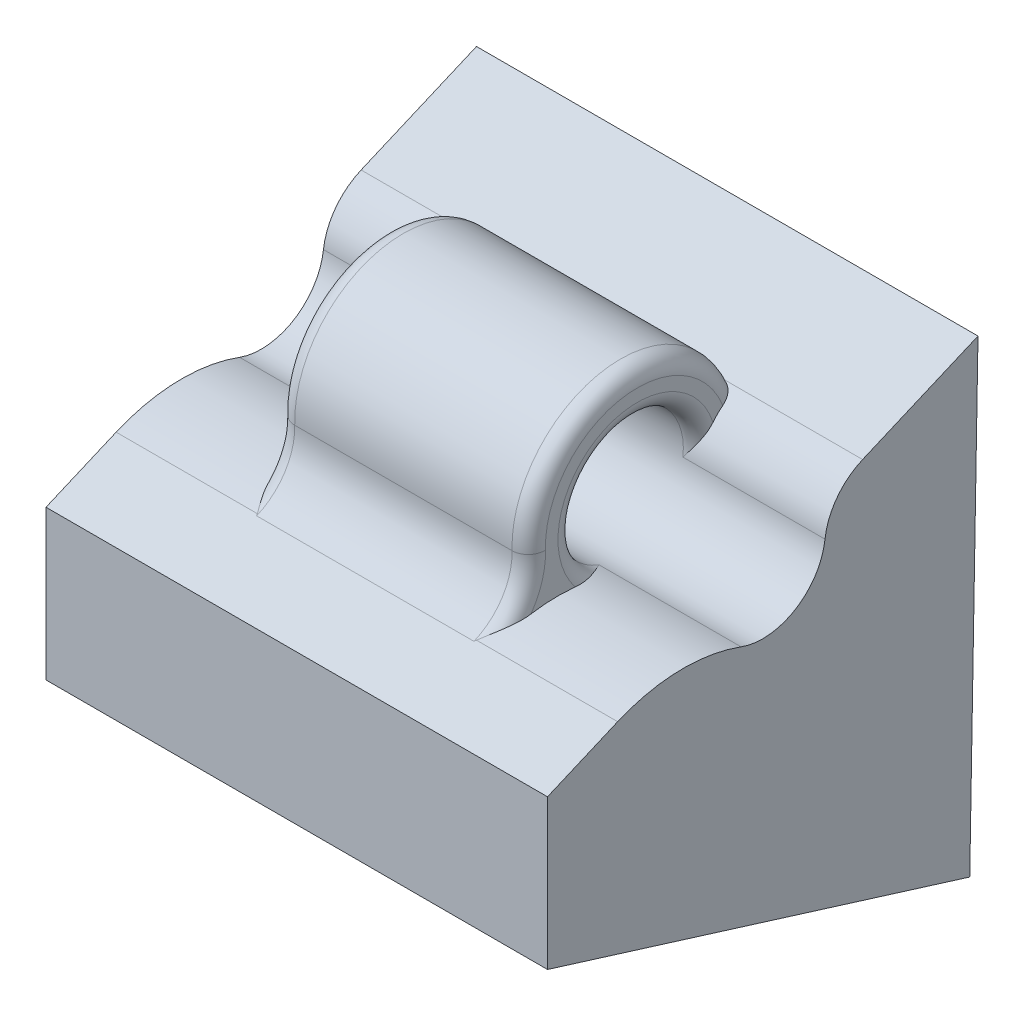
ISO-10303-21;
HEADER;
FILE_DESCRIPTION(('STEP AP214'),'2;1');
FILE_NAME('part.step','',(''),(''),'','','');
FILE_SCHEMA(('AUTOMOTIVE_DESIGN { 1 0 10303 214 1 1 1 1 }'));
ENDSEC;
DATA;
#1=APPLICATION_CONTEXT('core data for automotive mechanical design processes');
#2=APPLICATION_PROTOCOL_DEFINITION('international standard','automotive_design',2000,#1);
#3=PRODUCT_CONTEXT('',#1,'mechanical');
#4=PRODUCT('Part','Part','',(#3));
#5=PRODUCT_RELATED_PRODUCT_CATEGORY('part','',(#4));
#6=PRODUCT_DEFINITION_FORMATION('','',#4);
#7=PRODUCT_DEFINITION_CONTEXT('part definition',#1,'design');
#8=PRODUCT_DEFINITION('design','',#6,#7);
#9=PRODUCT_DEFINITION_SHAPE('','',#8);
#10=(LENGTH_UNIT() NAMED_UNIT(*) SI_UNIT(.MILLI.,.METRE.));
#11=(NAMED_UNIT(*) PLANE_ANGLE_UNIT() SI_UNIT($,.RADIAN.));
#12=(NAMED_UNIT(*) SI_UNIT($,.STERADIAN.) SOLID_ANGLE_UNIT());
#13=UNCERTAINTY_MEASURE_WITH_UNIT(LENGTH_MEASURE(1.E-05),#10,'distance_accuracy_value','');
#14=(GEOMETRIC_REPRESENTATION_CONTEXT(3) GLOBAL_UNCERTAINTY_ASSIGNED_CONTEXT((#13)) GLOBAL_UNIT_ASSIGNED_CONTEXT((#10,
#11,#12)) REPRESENTATION_CONTEXT('',''));
#15=CARTESIAN_POINT('',(0.,0.,0.));
#16=DIRECTION('',(0.,0.,1.));
#17=DIRECTION('',(1.,0.,0.));
#18=AXIS2_PLACEMENT_3D('',#15,#16,#17);
#19=CARTESIAN_POINT('',(-15.,-19.3262857115008,-5.66862767233871));
#20=DIRECTION('',(1.,0.,0.));
#21=DIRECTION('',(0.,0.,-1.));
#22=AXIS2_PLACEMENT_3D('',#19,#20,#21);
#23=CYLINDRICAL_SURFACE('',#22,20.);
#24=CARTESIAN_POINT('',(15.,-19.3262857115008,-5.66862767233871));
#25=DIRECTION('',(1.,0.,0.));
#26=DIRECTION('',(0.,0.,-1.));
#27=AXIS2_PLACEMENT_3D('',#24,#25,#26);
#28=CIRCLE('',#27,20.);
#29=CARTESIAN_POINT('',(15.,0.412883046353719,-2.44912200392603));
#30=VERTEX_POINT('',#29);
#31=CARTESIAN_POINT('',(15.,0.566287855537386,-7.73877667180103));
#32=VERTEX_POINT('',#31);
#33=EDGE_CURVE('E278',#30,#32,#28,.F.);
#34=ORIENTED_EDGE('',*,*,#33,.F.);
#35=CARTESIAN_POINT('',(15.,0.412883046353719,-2.44912200392603));
#36=CARTESIAN_POINT('',(14.9999712425001,0.392012198522315,-2.32109758519576));
#37=CARTESIAN_POINT('',(14.9935706108891,0.369901398564982,-2.19343269968543));
#38=CARTESIAN_POINT('',(14.9696875011824,0.323452890386708,-1.93978694534235));
#39=CARTESIAN_POINT('',(14.9522264673852,0.299119569224137,-1.8138032984124));
#40=CARTESIAN_POINT('',(14.9081962437952,0.248767911984274,-1.56581270127505));
#41=CARTESIAN_POINT('',(14.8817641035994,0.222779450848537,-1.44377453533818));
#42=CARTESIAN_POINT('',(14.8210753723815,0.16897148383558,-1.20205448064926));
#43=CARTESIAN_POINT('',(14.7868165265419,0.141151451943277,-1.08237328173612));
#44=CARTESIAN_POINT('',(14.7044614832426,0.0783359396207669,-0.822830786295997));
#45=CARTESIAN_POINT('',(14.6549716125155,0.0429874180444211,-0.683500125342862));
#46=CARTESIAN_POINT('',(14.5482955722852,-0.0299068648678995,-0.408397379718972));
#47=CARTESIAN_POINT('',(14.491107319599,-0.0674532193780413,-0.272626270185926));
#48=CARTESIAN_POINT('',(14.3703375113502,-0.14471500201004,-0.00409554854887269));
#49=CARTESIAN_POINT('',(14.3067375453569,-0.184436517544798,0.128653967943245));
#50=CARTESIAN_POINT('',(14.1745777181307,-0.265858639660227,0.390991130587072));
#51=CARTESIAN_POINT('',(14.1060186915753,-0.307558912784427,0.520579303948582));
#52=CARTESIAN_POINT('',(13.96251036623,-0.394454457632333,0.781594432597753));
#53=CARTESIAN_POINT('',(13.887419835391,-0.439721517512311,0.912919458458649));
#54=CARTESIAN_POINT('',(13.7725265920543,-0.5092204144354,1.10800980810453));
#55=CARTESIAN_POINT('',(13.7338490574858,-0.532655256492938,1.17272940656447));
#56=CARTESIAN_POINT('',(13.6558782579908,-0.580067740311381,1.30159662606592));
#57=CARTESIAN_POINT('',(13.6165849953779,-0.604045380032892,1.36574424925519));
#58=CARTESIAN_POINT('',(13.5378240354276,-0.652376630093399,1.49305652589641));
#59=CARTESIAN_POINT('',(13.498359853992,-0.676726074419333,1.55622494324603));
#60=CARTESIAN_POINT('',(13.419129283196,-0.725998525516448,1.68214702818652));
#61=CARTESIAN_POINT('',(13.3793628948121,-0.750921530434878,1.74490069711629));
#62=CARTESIAN_POINT('',(13.299809595018,-0.801384193369101,1.87011084484688));
#63=CARTESIAN_POINT('',(13.2600226952933,-0.826923637369684,1.93256741802897));
#64=CARTESIAN_POINT('',(13.2007903023415,-0.865810726555095,2.02630666388542));
#65=CARTESIAN_POINT('',(13.181120181929,-0.878869855541046,2.05756318737693));
#66=CARTESIAN_POINT('',(13.1425380556263,-0.905317411519973,2.12040785124825));
#67=CARTESIAN_POINT('',(13.1236261746364,-0.91870589218375,2.15199604518952));
#68=CARTESIAN_POINT('',(13.1054009590093,-0.932325399285941,2.1839021131932));
#69=B_SPLINE_CURVE_WITH_KNOTS('',3,(#35,#36,#37,#38,#39,#40,#41,#42,#43,#44,#45,#46,#47,#48,#49,
#50,#51,#52,#53,#54,#55,#56,#57,#58,#59,#60,#61,#62,#63,#64,#65,#66,#67,#68),.UNSPECIFIED.,.F.,
.F.,(4,2,2,2,2,2,2,2,2,2,2,2,2,2,2,2,4),(0.,0.388758995316807,0.776766548423315,
1.15909513205429,1.54153400100867,1.99730141098121,2.45319240051073,2.91043187224491,
3.36759456261266,3.84122604705611,4.07808398727538,4.31494103772192,4.55002246815443,
4.78510313931934,5.02010333693873,5.13761127789712,5.25513849636359),.UNSPECIFIED.);
#70=CARTESIAN_POINT('',(13.1054009590091,-0.932325399285929,2.18390211319316));
#71=VERTEX_POINT('',#70);
#72=EDGE_CURVE('E355',#30,#71,#69,.T.);
#73=ORIENTED_EDGE('',*,*,#72,.T.);
#74=DIRECTION('',(1.,0.,0.));
#75=VECTOR('',#74,1.);
#76=CARTESIAN_POINT('',(-30.,-0.932325399285929,2.18390211319316));
#77=LINE('',#76,#75);
#78=CARTESIAN_POINT('',(30.,-0.932325399285929,2.18390211319316));
#79=VERTEX_POINT('',#78);
#80=EDGE_CURVE('E259',#79,#71,#77,.F.);
#81=ORIENTED_EDGE('',*,*,#80,.F.);
#82=CARTESIAN_POINT('',(30.,-19.3262857115008,-5.66862767233871));
#83=DIRECTION('',(1.,0.,0.));
#84=DIRECTION('',(0.,0.,-1.));
#85=AXIS2_PLACEMENT_3D('',#82,#83,#84);
#86=CIRCLE('',#85,20.);
#87=CARTESIAN_POINT('',(30.,-0.559287322726545,-12.5823655525122));
#88=VERTEX_POINT('',#87);
#89=EDGE_CURVE('E271',#88,#79,#86,.T.);
#90=ORIENTED_EDGE('',*,*,#89,.F.);
#91=DIRECTION('',(1.,0.,0.));
#92=VECTOR('',#91,1.);
#93=CARTESIAN_POINT('',(-15.,-0.559287322726545,-12.5823655525122));
#94=LINE('',#93,#92);
#95=CARTESIAN_POINT('',(13.,-0.559287322726544,-12.5823655525122));
#96=VERTEX_POINT('',#95);
#97=EDGE_CURVE('E262',#96,#88,#94,.T.);
#98=ORIENTED_EDGE('',*,*,#97,.F.);
#99=CARTESIAN_POINT('',(15.,0.566287855537388,-7.73877667180103));
#100=CARTESIAN_POINT('',(14.9999712824843,0.552876355309134,-7.86774863849179));
#101=CARTESIAN_POINT('',(14.9935733410965,0.538207071912411,-7.9964337137294));
#102=CARTESIAN_POINT('',(14.9697025239842,0.506554132193944,-8.25221480091346));
#103=CARTESIAN_POINT('',(14.9522543338735,0.489575700591173,-8.37931371257186));
#104=CARTESIAN_POINT('',(14.9082501475066,0.453703975215936,-8.62967663138598));
#105=CARTESIAN_POINT('',(14.8818285864447,0.434841692259891,-8.75296949969496));
#106=CARTESIAN_POINT('',(14.8211511884142,0.395148190183763,-8.99734695182514));
#107=CARTESIAN_POINT('',(14.7868906373842,0.374315790753399,-9.11843015934116));
#108=CARTESIAN_POINT('',(14.7018857686527,0.325130966729402,-9.38957734524561));
#109=CARTESIAN_POINT('',(14.6491744564062,0.296238247825559,-9.53892332934081));
#110=CARTESIAN_POINT('',(14.5352090099173,0.23577069497492,-9.83379476285277));
#111=CARTESIAN_POINT('',(14.4739510431471,0.204194660261093,-9.97931846328363));
#112=CARTESIAN_POINT('',(14.3445419157242,0.13849458823674,-10.2669011994642));
#113=CARTESIAN_POINT('',(14.2763815210566,0.104367154084579,-10.4089552698466));
#114=CARTESIAN_POINT('',(14.1346928084361,0.0337027584337625,-10.6897622999649));
#115=CARTESIAN_POINT('',(14.0611634240563,-0.00283468161728427,-10.8285145965827));
#116=CARTESIAN_POINT('',(13.8332777576799,-0.116566381528935,-11.2426063812963));
#117=CARTESIAN_POINT('',(13.6726912463684,-0.197357487692704,-11.5135144077749));
#118=CARTESIAN_POINT('',(13.3439632401528,-0.36861681530225,-12.0471250792966));
#119=CARTESIAN_POINT('',(13.1758275200498,-0.459077710550422,-12.3098337442285));
#120=CARTESIAN_POINT('',(13.0051006104007,-0.556376724584916,-12.5744610096459));
#121=CARTESIAN_POINT('',(13.0025503032892,-0.557831403619126,-12.5784135115691));
#122=CARTESIAN_POINT('',(13.,-0.559287322726544,-12.5823655525122));
#123=B_SPLINE_CURVE_WITH_KNOTS('',3,(#99,#100,#101,#102,#103,#104,#105,#106,#107,#108,#109,#110,
#111,#112,#113,#114,#115,#116,#117,#118,#119,#120,#121,#122),.UNSPECIFIED.,.F.,.F.,(4,2,2,2,2,2,
2,2,2,2,2,4),(0.,0.388617932635206,0.776370762978743,1.15855348078632,1.54096663518821,
2.02356449711834,2.50637946740758,2.9898490975625,3.47341502048871,4.44820459085722,
5.42226078926612,5.43703176878379),.UNSPECIFIED.);
#124=EDGE_CURVE('E58',#96,#32,#123,.F.);
#125=ORIENTED_EDGE('',*,*,#124,.T.);
#126=EDGE_LOOP('',(#34,#73,#81,#90,#98,#125));
#127=FACE_BOUND('',#126,.T.);
#128=ADVANCED_FACE('F47',(#127),#23,.T.);
#129=CARTESIAN_POINT('',(-30.,0.,0.));
#130=DIRECTION('',(0.,-0.919698015610742,-0.392626489276593));
#131=DIRECTION('',(0.,0.392626489276593,-0.919698015610742));
#132=AXIS2_PLACEMENT_3D('',#129,#130,#131);
#133=PLANE('',#132);
#134=DIRECTION('',(1.,0.,0.));
#135=VECTOR('',#134,1.);
#136=CARTESIAN_POINT('',(-15.,11.5824814336595,-27.1310914605169));
#137=LINE('',#136,#135);
#138=CARTESIAN_POINT('',(-13.,11.5824814336595,-27.1310914605169));
#139=VERTEX_POINT('',#138);
#140=CARTESIAN_POINT('',(13.,11.5824814336595,-27.1310914605169));
#141=VERTEX_POINT('',#140);
#142=EDGE_CURVE('E238',#139,#141,#137,.T.);
#143=ORIENTED_EDGE('',*,*,#142,.T.);
#144=CARTESIAN_POINT('',(13.,10.7972284551063,-25.2916954292954));
#145=DIRECTION('',(0.,-0.919698015610742,-0.392626489276593));
#146=DIRECTION('',(0.,0.392626489276593,-0.919698015610742));
#147=AXIS2_PLACEMENT_3D('',#144,#145,#146);
#148=CIRCLE('',#147,2.);
#149=CARTESIAN_POINT('',(13.1959164333708,11.5787047817472,-27.1222449375128));
#150=VERTEX_POINT('',#149);
#151=EDGE_CURVE('E492',#141,#150,#148,.T.);
#152=ORIENTED_EDGE('',*,*,#151,.T.);
#153=DIRECTION('',(1.,0.,0.));
#154=VECTOR('',#153,1.);
#155=CARTESIAN_POINT('',(-30.,11.5787047817472,-27.1222449375128));
#156=LINE('',#155,#154);
#157=CARTESIAN_POINT('',(30.,11.5787047817472,-27.1222449375128));
#158=VERTEX_POINT('',#157);
#159=EDGE_CURVE('E74',#150,#158,#156,.T.);
#160=ORIENTED_EDGE('',*,*,#159,.T.);
#161=DIRECTION('',(0.,0.392626489276593,-0.919698015610742));
#162=VECTOR('',#161,1.);
#163=CARTESIAN_POINT('',(30.,0.,0.));
#164=LINE('',#163,#162);
#165=CARTESIAN_POINT('',(30.,17.4718787728084,-40.926561694678));
#166=VERTEX_POINT('',#165);
#167=EDGE_CURVE('E248',#158,#166,#164,.T.);
#168=ORIENTED_EDGE('',*,*,#167,.T.);
#169=DIRECTION('',(1.,0.,0.));
#170=VECTOR('',#169,1.);
#171=CARTESIAN_POINT('',(-30.,17.4718787728084,-40.926561694678));
#172=LINE('',#171,#170);
#173=CARTESIAN_POINT('',(-30.,17.4718787728084,-40.926561694678));
#174=VERTEX_POINT('',#173);
#175=EDGE_CURVE('E200',#174,#166,#172,.T.);
#176=ORIENTED_EDGE('',*,*,#175,.F.);
#177=DIRECTION('',(0.,0.392626489276593,-0.919698015610742));
#178=VECTOR('',#177,1.);
#179=CARTESIAN_POINT('',(-30.,0.,0.));
#180=LINE('',#179,#178);
#181=CARTESIAN_POINT('',(-30.,11.5787047817472,-27.1222449375128));
#182=VERTEX_POINT('',#181);
#183=EDGE_CURVE('E253',#182,#174,#180,.T.);
#184=ORIENTED_EDGE('',*,*,#183,.F.);
#185=DIRECTION('',(1.,0.,0.));
#186=VECTOR('',#185,1.);
#187=CARTESIAN_POINT('',(-30.,11.5787047817472,-27.1222449375128));
#188=LINE('',#187,#186);
#189=CARTESIAN_POINT('',(-13.1959164333708,11.5787047817472,-27.1222449375128));
#190=VERTEX_POINT('',#189);
#191=EDGE_CURVE('E66',#182,#190,#188,.T.);
#192=ORIENTED_EDGE('',*,*,#191,.T.);
#193=CARTESIAN_POINT('',(-13.,10.7972284551063,-25.2916954292954));
#194=DIRECTION('',(0.,-0.919698015610742,-0.392626489276593));
#195=DIRECTION('',(0.,0.392626489276593,-0.919698015610742));
#196=AXIS2_PLACEMENT_3D('',#193,#194,#195);
#197=CIRCLE('',#196,2.);
#198=EDGE_CURVE('E410',#190,#139,#197,.T.);
#199=ORIENTED_EDGE('',*,*,#198,.T.);
#200=EDGE_LOOP('',(#143,#152,#160,#168,#176,#184,#192,#199));
#201=FACE_BOUND('',#200,.T.);
#202=ADVANCED_FACE('F455',(#201),#133,.F.);
#203=ORIENTED_EDGE('',*,*,#80,.T.);
#204=CARTESIAN_POINT('',(13.1054009590091,-0.932325399285926,2.18390211319316));
#205=CARTESIAN_POINT('',(13.0729275930426,-0.9570380494792,2.24178963724971));
#206=CARTESIAN_POINT('',(13.0404429995258,-0.981748423814734,2.2996718302807));
#207=CARTESIAN_POINT('',(13.0052981935809,-1.00847066986816,2.3622666814668));
#208=CARTESIAN_POINT('',(13.0026491340948,-1.0104848023204,2.36698463522209));
#209=CARTESIAN_POINT('',(13.,-1.01249891964926,2.37170255355197));
#210=B_SPLINE_CURVE_WITH_KNOTS('',3,(#204,#205,#206,#207,#208,#209),.UNSPECIFIED.,.F.,.F.,(4,2,
4),(0.,0.212475403688337,0.229795911764035),.UNSPECIFIED.);
#211=CARTESIAN_POINT('',(13.,-1.01249891964926,2.37170255355197));
#212=VERTEX_POINT('',#211);
#213=EDGE_CURVE('E365',#71,#212,#210,.T.);
#214=ORIENTED_EDGE('',*,*,#213,.T.);
#215=DIRECTION('',(1.,0.,0.));
#216=VECTOR('',#215,1.);
#217=CARTESIAN_POINT('',(-30.,-1.01249891964926,2.37170255355197));
#218=LINE('',#217,#216);
#219=CARTESIAN_POINT('',(-13.,-1.01249891964926,2.37170255355197));
#220=VERTEX_POINT('',#219);
#221=EDGE_CURVE('E310',#212,#220,#218,.F.);
#222=ORIENTED_EDGE('',*,*,#221,.T.);
#223=CARTESIAN_POINT('',(-13.1054009590092,-0.932325399285929,2.18390211319316));
#224=CARTESIAN_POINT('',(-13.0729275930435,-0.957038049479378,2.24178963725011));
#225=CARTESIAN_POINT('',(-13.0404429995267,-0.981748423814924,2.29967183028114));
#226=CARTESIAN_POINT('',(-13.0052981935811,-1.00847066986818,2.36226668146687));
#227=CARTESIAN_POINT('',(-13.0026491340948,-1.01048480232041,2.36698463522212));
#228=CARTESIAN_POINT('',(-13.,-1.01249891964926,2.37170255355197));
#229=B_SPLINE_CURVE_WITH_KNOTS('',3,(#223,#224,#225,#226,#227,#228),.UNSPECIFIED.,.F.,.F.,(4,2,
4),(0.,0.212475403688361,0.229795911764061),.UNSPECIFIED.);
#230=CARTESIAN_POINT('',(-13.1054009590092,-0.932325399285929,2.18390211319316));
#231=VERTEX_POINT('',#230);
#232=EDGE_CURVE('E486',#220,#231,#229,.F.);
#233=ORIENTED_EDGE('',*,*,#232,.T.);
#234=CARTESIAN_POINT('',(-30.,-0.932325399285929,2.18390211319316));
#235=VERTEX_POINT('',#234);
#236=EDGE_CURVE('E258',#231,#235,#77,.F.);
#237=ORIENTED_EDGE('',*,*,#236,.T.);
#238=CARTESIAN_POINT('',(-30.,-4.51520462668082,10.5765271795235));
#239=VERTEX_POINT('',#238);
#240=EDGE_CURVE('E254',#239,#235,#180,.T.);
#241=ORIENTED_EDGE('',*,*,#240,.F.);
#242=DIRECTION('',(1.,0.,0.));
#243=VECTOR('',#242,1.);
#244=CARTESIAN_POINT('',(-30.,-4.51520462668082,10.5765271795235));
#245=LINE('',#244,#243);
#246=CARTESIAN_POINT('',(30.,-4.51520462668082,10.5765271795235));
#247=VERTEX_POINT('',#246);
#248=EDGE_CURVE('E239',#239,#247,#245,.T.);
#249=ORIENTED_EDGE('',*,*,#248,.T.);
#250=EDGE_CURVE('E249',#247,#79,#164,.T.);
#251=ORIENTED_EDGE('',*,*,#250,.T.);
#252=EDGE_LOOP('',(#203,#214,#222,#233,#237,#241,#249,#251));
#253=FACE_BOUND('',#252,.T.);
#254=ADVANCED_FACE('F382',(#253),#133,.F.);
#255=CARTESIAN_POINT('',(-30.,0.,0.));
#256=DIRECTION('',(1.,0.,0.));
#257=DIRECTION('',(0.,0.,-1.));
#258=AXIS2_PLACEMENT_3D('',#255,#256,#257);
#259=PLANE('',#258);
#260=CARTESIAN_POINT('',(-30.,6.47833707306379,-15.1750172575772));
#261=DIRECTION('',(1.,0.,0.));
#262=DIRECTION('',(0.,0.,-1.));
#263=AXIS2_PLACEMENT_3D('',#260,#261,#262);
#264=CIRCLE('',#263,7.5);
#265=CARTESIAN_POINT('',(-30.,-0.559287322726545,-12.5823655525122));
#266=VERTEX_POINT('',#265);
#267=CARTESIAN_POINT('',(-30.,5.57965336886522,-22.6209804323323));
#268=VERTEX_POINT('',#267);
#269=EDGE_CURVE('E217',#266,#268,#264,.T.);
#270=ORIENTED_EDGE('',*,*,#269,.T.);
#271=CARTESIAN_POINT('',(-30.,4.68096966466665,-30.0669436070873));
#272=DIRECTION('',(1.,0.,0.));
#273=DIRECTION('',(0.,0.,-1.));
#274=AXIS2_PLACEMENT_3D('',#271,#272,#273);
#275=CIRCLE('',#274,7.5);
#276=EDGE_CURVE('E295',#268,#182,#275,.F.);
#277=ORIENTED_EDGE('',*,*,#276,.T.);
#278=ORIENTED_EDGE('',*,*,#183,.T.);
#279=DIRECTION('',(0.,0.999842009877542,-0.017775131055396));
#280=VECTOR('',#279,1.);
#281=CARTESIAN_POINT('',(-30.,-38.087855848142,-39.9388240776005));
#282=LINE('',#281,#280);
#283=CARTESIAN_POINT('',(-30.,-38.087855848142,-39.9388240776005));
#284=VERTEX_POINT('',#283);
#285=EDGE_CURVE('E229',#284,#174,#282,.T.);
#286=ORIENTED_EDGE('',*,*,#285,.F.);
#287=DIRECTION('',(0.,-0.296375157229844,-0.955071602644003));
#288=VECTOR('',#287,1.);
#289=CARTESIAN_POINT('',(-30.,-22.412072870296,10.5765271795235));
#290=LINE('',#289,#288);
#291=CARTESIAN_POINT('',(-30.,-22.412072870296,10.5765271795235));
#292=VERTEX_POINT('',#291);
#293=EDGE_CURVE('E195',#292,#284,#290,.T.);
#294=ORIENTED_EDGE('',*,*,#293,.F.);
#295=DIRECTION('',(0.,-1.,0.));
#296=VECTOR('',#295,1.);
#297=CARTESIAN_POINT('',(-30.,-4.51520462668082,10.5765271795235));
#298=LINE('',#297,#296);
#299=EDGE_CURVE('E201',#239,#292,#298,.T.);
#300=ORIENTED_EDGE('',*,*,#299,.F.);
#301=ORIENTED_EDGE('',*,*,#240,.T.);
#302=CARTESIAN_POINT('',(-30.,-19.3262857115008,-5.66862767233871));
#303=DIRECTION('',(1.,0.,0.));
#304=DIRECTION('',(0.,0.,-1.));
#305=AXIS2_PLACEMENT_3D('',#302,#303,#304);
#306=CIRCLE('',#305,20.);
#307=EDGE_CURVE('E268',#235,#266,#306,.F.);
#308=ORIENTED_EDGE('',*,*,#307,.T.);
#309=EDGE_LOOP('',(#270,#277,#278,#286,#294,#300,#301,#308));
#310=FACE_BOUND('',#309,.T.);
#311=ADVANCED_FACE('F530',(#310),#259,.F.);
#312=CARTESIAN_POINT('',(30.,0.,0.));
#313=DIRECTION('',(1.,0.,0.));
#314=DIRECTION('',(0.,0.,-1.));
#315=AXIS2_PLACEMENT_3D('',#312,#313,#314);
#316=PLANE('',#315);
#317=ORIENTED_EDGE('',*,*,#167,.F.);
#318=CARTESIAN_POINT('',(30.,4.68096966466665,-30.0669436070873));
#319=DIRECTION('',(1.,0.,0.));
#320=DIRECTION('',(0.,0.,-1.));
#321=AXIS2_PLACEMENT_3D('',#318,#319,#320);
#322=CIRCLE('',#321,7.5);
#323=CARTESIAN_POINT('',(30.,5.57965336886522,-22.6209804323323));
#324=VERTEX_POINT('',#323);
#325=EDGE_CURVE('E286',#158,#324,#322,.T.);
#326=ORIENTED_EDGE('',*,*,#325,.T.);
#327=CARTESIAN_POINT('',(30.,6.47833707306379,-15.1750172575772));
#328=DIRECTION('',(1.,0.,0.));
#329=DIRECTION('',(0.,0.,-1.));
#330=AXIS2_PLACEMENT_3D('',#327,#328,#329);
#331=CIRCLE('',#330,7.5);
#332=EDGE_CURVE('E221',#88,#324,#331,.T.);
#333=ORIENTED_EDGE('',*,*,#332,.F.);
#334=ORIENTED_EDGE('',*,*,#89,.T.);
#335=ORIENTED_EDGE('',*,*,#250,.F.);
#336=DIRECTION('',(0.,-1.,0.));
#337=VECTOR('',#336,1.);
#338=CARTESIAN_POINT('',(30.,-4.51520462668082,10.5765271795235));
#339=LINE('',#338,#337);
#340=CARTESIAN_POINT('',(30.,-22.412072870296,10.5765271795235));
#341=VERTEX_POINT('',#340);
#342=EDGE_CURVE('E211',#247,#341,#339,.T.);
#343=ORIENTED_EDGE('',*,*,#342,.T.);
#344=DIRECTION('',(0.,-0.296375157229844,-0.955071602644003));
#345=VECTOR('',#344,1.);
#346=CARTESIAN_POINT('',(30.,-22.412072870296,10.5765271795235));
#347=LINE('',#346,#345);
#348=CARTESIAN_POINT('',(30.,-38.087855848142,-39.9388240776005));
#349=VERTEX_POINT('',#348);
#350=EDGE_CURVE('E193',#341,#349,#347,.T.);
#351=ORIENTED_EDGE('',*,*,#350,.T.);
#352=DIRECTION('',(0.,0.999842009877542,-0.017775131055396));
#353=VECTOR('',#352,1.);
#354=CARTESIAN_POINT('',(30.,-38.087855848142,-39.9388240776005));
#355=LINE('',#354,#353);
#356=EDGE_CURVE('E205',#349,#166,#355,.T.);
#357=ORIENTED_EDGE('',*,*,#356,.T.);
#358=EDGE_LOOP('',(#317,#326,#333,#334,#335,#343,#351,#357));
#359=FACE_BOUND('',#358,.T.);
#360=ADVANCED_FACE('F214',(#359),#316,.T.);
#361=CARTESIAN_POINT('',(-15.,6.47833707306379,-15.1750172575772));
#362=DIRECTION('',(1.,0.,0.));
#363=DIRECTION('',(0.,0.,-1.));
#364=AXIS2_PLACEMENT_3D('',#361,#362,#363);
#365=CYLINDRICAL_SURFACE('',#364,7.5);
#366=CARTESIAN_POINT('',(13.,6.47833707306379,-15.1750172575772));
#367=DIRECTION('',(1.,0.,0.));
#368=DIRECTION('',(0.,0.,-1.));
#369=AXIS2_PLACEMENT_3D('',#366,#367,#368);
#370=CIRCLE('',#369,7.5);
#371=CARTESIAN_POINT('',(13.,5.57965336886522,-22.6209804323323));
#372=VERTEX_POINT('',#371);
#373=EDGE_CURVE('E347',#372,#96,#370,.T.);
#374=ORIENTED_EDGE('',*,*,#373,.T.);
#375=ORIENTED_EDGE('',*,*,#97,.T.);
#376=ORIENTED_EDGE('',*,*,#332,.T.);
#377=DIRECTION('',(1.,0.,0.));
#378=VECTOR('',#377,1.);
#379=CARTESIAN_POINT('',(-15.,5.57965336886522,-22.6209804323323));
#380=LINE('',#379,#378);
#381=EDGE_CURVE('E292',#324,#372,#380,.F.);
#382=ORIENTED_EDGE('',*,*,#381,.T.);
#383=EDGE_LOOP('',(#374,#375,#376,#382));
#384=FACE_BOUND('',#383,.T.);
#385=DIRECTION('',(1.,0.,0.));
#386=VECTOR('',#385,1.);
#387=CARTESIAN_POINT('',(-22.5,-0.559287322726545,-12.5823655525122));
#388=LINE('',#387,#386);
#389=CARTESIAN_POINT('',(-13.,-0.559287322726544,-12.5823655525122));
#390=VERTEX_POINT('',#389);
#391=EDGE_CURVE('E265',#266,#390,#388,.T.);
#392=ORIENTED_EDGE('',*,*,#391,.T.);
#393=CARTESIAN_POINT('',(-13.,6.47833707306379,-15.1750172575772));
#394=DIRECTION('',(1.,0.,0.));
#395=DIRECTION('',(0.,0.,-1.));
#396=AXIS2_PLACEMENT_3D('',#393,#394,#395);
#397=CIRCLE('',#396,7.5);
#398=CARTESIAN_POINT('',(-13.,5.57965336886522,-22.6209804323323));
#399=VERTEX_POINT('',#398);
#400=EDGE_CURVE('E351',#390,#399,#397,.F.);
#401=ORIENTED_EDGE('',*,*,#400,.T.);
#402=DIRECTION('',(1.,0.,0.));
#403=VECTOR('',#402,1.);
#404=CARTESIAN_POINT('',(-15.,5.57965336886522,-22.6209804323323));
#405=LINE('',#404,#403);
#406=EDGE_CURVE('E289',#399,#268,#405,.F.);
#407=ORIENTED_EDGE('',*,*,#406,.T.);
#408=ORIENTED_EDGE('',*,*,#269,.F.);
#409=EDGE_LOOP('',(#392,#401,#407,#408));
#410=FACE_BOUND('',#409,.T.);
#411=ADVANCED_FACE('F539',(#384,#410),#365,.F.);
#412=CARTESIAN_POINT('',(-15.,6.47833707306379,-15.1750172575772));
#413=DIRECTION('',(1.,0.,0.));
#414=DIRECTION('',(0.,0.,-1.));
#415=AXIS2_PLACEMENT_3D('',#412,#413,#414);
#416=CYLINDRICAL_SURFACE('',#415,13.);
#417=DIRECTION('',(1.,0.,0.));
#418=VECTOR('',#417,1.);
#419=CARTESIAN_POINT('',(-15.,6.1022243226627,-2.18045919664321));
#420=LINE('',#419,#418);
#421=CARTESIAN_POINT('',(-13.,6.1022243226627,-2.18045919664321));
#422=VERTEX_POINT('',#421);
#423=CARTESIAN_POINT('',(13.,6.1022243226627,-2.18045919664321));
#424=VERTEX_POINT('',#423);
#425=EDGE_CURVE('E306',#422,#424,#420,.T.);
#426=ORIENTED_EDGE('',*,*,#425,.T.);
#427=CARTESIAN_POINT('',(13.,6.47833707306379,-15.1750172575772));
#428=DIRECTION('',(1.,0.,0.));
#429=DIRECTION('',(0.,0.,-1.));
#430=AXIS2_PLACEMENT_3D('',#427,#428,#429);
#431=CIRCLE('',#430,13.);
#432=EDGE_CURVE('E344',#424,#141,#431,.F.);
#433=ORIENTED_EDGE('',*,*,#432,.T.);
#434=ORIENTED_EDGE('',*,*,#142,.F.);
#435=CARTESIAN_POINT('',(-13.,6.47833707306379,-15.1750172575772));
#436=DIRECTION('',(1.,0.,0.));
#437=DIRECTION('',(0.,0.,-1.));
#438=AXIS2_PLACEMENT_3D('',#435,#436,#437);
#439=CIRCLE('',#438,13.);
#440=EDGE_CURVE('E341',#139,#422,#439,.T.);
#441=ORIENTED_EDGE('',*,*,#440,.T.);
#442=EDGE_LOOP('',(#426,#433,#434,#441));
#443=FACE_BOUND('',#442,.T.);
#444=ADVANCED_FACE('F547',(#443),#416,.T.);
#445=CARTESIAN_POINT('',(-15.,6.47833707306379,-15.1750172575772));
#446=DIRECTION('',(1.,0.,0.));
#447=DIRECTION('',(0.,0.,-1.));
#448=AXIS2_PLACEMENT_3D('',#445,#446,#447);
#449=PLANE('',#448);
#450=CARTESIAN_POINT('',(-15.,-19.3262857115008,-5.66862767233871));
#451=DIRECTION('',(1.,0.,0.));
#452=DIRECTION('',(0.,0.,-1.));
#453=AXIS2_PLACEMENT_3D('',#450,#451,#452);
#454=CIRCLE('',#453,20.);
#455=CARTESIAN_POINT('',(-15.,0.566287855537386,-7.73877667180103));
#456=VERTEX_POINT('',#455);
#457=CARTESIAN_POINT('',(-15.,0.412883046353719,-2.44912200392603));
#458=VERTEX_POINT('',#457);
#459=EDGE_CURVE('E274',#456,#458,#454,.T.);
#460=ORIENTED_EDGE('',*,*,#459,.T.);
#461=CARTESIAN_POINT('',(-15.,5.88523619743131,5.31640122312642));
#462=DIRECTION('',(1.,0.,0.));
#463=DIRECTION('',(0.,0.,-1.));
#464=AXIS2_PLACEMENT_3D('',#461,#462,#463);
#465=CIRCLE('',#464,9.5);
#466=CARTESIAN_POINT('',(-15.,6.16008782272441,-4.17962197524845));
#467=VERTEX_POINT('',#466);
#468=EDGE_CURVE('E337',#458,#467,#465,.T.);
#469=ORIENTED_EDGE('',*,*,#468,.T.);
#470=CARTESIAN_POINT('',(-15.,6.47833707306379,-15.1750172575772));
#471=DIRECTION('',(1.,0.,0.));
#472=DIRECTION('',(0.,0.,-1.));
#473=AXIS2_PLACEMENT_3D('',#470,#471,#472);
#474=CIRCLE('',#473,11.);
#475=CARTESIAN_POINT('',(-15.,10.5477562709484,-25.3945978454433));
#476=VERTEX_POINT('',#475);
#477=EDGE_CURVE('E334',#467,#476,#474,.F.);
#478=ORIENTED_EDGE('',*,*,#477,.T.);
#479=CARTESIAN_POINT('',(-15.,4.68096966466665,-30.0669436070873));
#480=DIRECTION('',(1.,0.,0.));
#481=DIRECTION('',(0.,0.,-1.));
#482=AXIS2_PLACEMENT_3D('',#479,#480,#481);
#483=CIRCLE('',#482,7.5);
#484=CARTESIAN_POINT('',(-15.,9.37957495830757,-24.2211666446494));
#485=VERTEX_POINT('',#484);
#486=EDGE_CURVE('E302',#476,#485,#483,.T.);
#487=ORIENTED_EDGE('',*,*,#486,.T.);
#488=CARTESIAN_POINT('',(-15.,6.47833707306379,-15.1750172575772));
#489=DIRECTION('',(1.,0.,0.));
#490=DIRECTION('',(0.,0.,-1.));
#491=AXIS2_PLACEMENT_3D('',#488,#489,#490);
#492=CIRCLE('',#491,9.5);
#493=EDGE_CURVE('E330',#485,#456,#492,.T.);
#494=ORIENTED_EDGE('',*,*,#493,.T.);
#495=EDGE_LOOP('',(#460,#469,#478,#487,#494));
#496=FACE_BOUND('',#495,.T.);
#497=ADVANCED_FACE('F518',(#496),#449,.F.);
#498=CARTESIAN_POINT('',(15.,6.47833707306379,-15.1750172575772));
#499=DIRECTION('',(1.,0.,0.));
#500=DIRECTION('',(0.,0.,-1.));
#501=AXIS2_PLACEMENT_3D('',#498,#499,#500);
#502=PLANE('',#501);
#503=CARTESIAN_POINT('',(15.,6.47833707306379,-15.1750172575772));
#504=DIRECTION('',(1.,0.,0.));
#505=DIRECTION('',(0.,0.,-1.));
#506=AXIS2_PLACEMENT_3D('',#503,#504,#505);
#507=CIRCLE('',#506,11.);
#508=CARTESIAN_POINT('',(15.,10.5477562709484,-25.3945978454433));
#509=VERTEX_POINT('',#508);
#510=CARTESIAN_POINT('',(15.,6.16008782272441,-4.17962197524845));
#511=VERTEX_POINT('',#510);
#512=EDGE_CURVE('E317',#509,#511,#507,.T.);
#513=ORIENTED_EDGE('',*,*,#512,.T.);
#514=CARTESIAN_POINT('',(15.,5.88523619743131,5.31640122312642));
#515=DIRECTION('',(1.,0.,0.));
#516=DIRECTION('',(0.,0.,-1.));
#517=AXIS2_PLACEMENT_3D('',#514,#515,#516);
#518=CIRCLE('',#517,9.5);
#519=EDGE_CURVE('E320',#511,#30,#518,.F.);
#520=ORIENTED_EDGE('',*,*,#519,.T.);
#521=ORIENTED_EDGE('',*,*,#33,.T.);
#522=CARTESIAN_POINT('',(15.,6.47833707306379,-15.1750172575772));
#523=DIRECTION('',(1.,0.,0.));
#524=DIRECTION('',(0.,0.,-1.));
#525=AXIS2_PLACEMENT_3D('',#522,#523,#524);
#526=CIRCLE('',#525,9.5);
#527=CARTESIAN_POINT('',(15.,9.37957495830757,-24.2211666446494));
#528=VERTEX_POINT('',#527);
#529=EDGE_CURVE('E314',#32,#528,#526,.F.);
#530=ORIENTED_EDGE('',*,*,#529,.T.);
#531=CARTESIAN_POINT('',(15.,4.68096966466665,-30.0669436070873));
#532=DIRECTION('',(1.,0.,0.));
#533=DIRECTION('',(0.,0.,-1.));
#534=AXIS2_PLACEMENT_3D('',#531,#532,#533);
#535=CIRCLE('',#534,7.5);
#536=EDGE_CURVE('E298',#528,#509,#535,.F.);
#537=ORIENTED_EDGE('',*,*,#536,.T.);
#538=EDGE_LOOP('',(#513,#520,#521,#530,#537));
#539=FACE_BOUND('',#538,.T.);
#540=ADVANCED_FACE('F467',(#539),#502,.T.);
#541=CARTESIAN_POINT('',(-30.,-22.412072870296,10.5765271795235));
#542=DIRECTION('',(0.,-0.955071602644003,0.296375157229844));
#543=DIRECTION('',(0.,-0.296375157229844,-0.955071602644003));
#544=AXIS2_PLACEMENT_3D('',#541,#542,#543);
#545=PLANE('',#544);
#546=DIRECTION('',(1.,0.,0.));
#547=VECTOR('',#546,1.);
#548=CARTESIAN_POINT('',(-30.,-38.087855848142,-39.9388240776005));
#549=LINE('',#548,#547);
#550=EDGE_CURVE('E189',#284,#349,#549,.T.);
#551=ORIENTED_EDGE('',*,*,#550,.T.);
#552=ORIENTED_EDGE('',*,*,#350,.F.);
#553=DIRECTION('',(1.,0.,0.));
#554=VECTOR('',#553,1.);
#555=CARTESIAN_POINT('',(-30.,-22.412072870296,10.5765271795235));
#556=LINE('',#555,#554);
#557=EDGE_CURVE('E235',#292,#341,#556,.T.);
#558=ORIENTED_EDGE('',*,*,#557,.F.);
#559=ORIENTED_EDGE('',*,*,#293,.T.);
#560=EDGE_LOOP('',(#551,#552,#558,#559));
#561=FACE_BOUND('',#560,.T.);
#562=ADVANCED_FACE('F191',(#561),#545,.T.);
#563=CARTESIAN_POINT('',(-30.,-4.51520462668082,10.5765271795235));
#564=DIRECTION('',(0.,0.,1.));
#565=DIRECTION('',(1.,0.,0.));
#566=AXIS2_PLACEMENT_3D('',#563,#564,#565);
#567=PLANE('',#566);
#568=ORIENTED_EDGE('',*,*,#557,.T.);
#569=ORIENTED_EDGE('',*,*,#342,.F.);
#570=ORIENTED_EDGE('',*,*,#248,.F.);
#571=ORIENTED_EDGE('',*,*,#299,.T.);
#572=EDGE_LOOP('',(#568,#569,#570,#571));
#573=FACE_BOUND('',#572,.T.);
#574=ADVANCED_FACE('F545',(#573),#567,.T.);
#575=CARTESIAN_POINT('',(-30.,-38.087855848142,-39.9388240776005));
#576=DIRECTION('',(0.,-0.017775131055396,-0.999842009877542));
#577=DIRECTION('',(0.,0.999842009877542,-0.017775131055396));
#578=AXIS2_PLACEMENT_3D('',#575,#576,#577);
#579=PLANE('',#578);
#580=ORIENTED_EDGE('',*,*,#175,.T.);
#581=ORIENTED_EDGE('',*,*,#356,.F.);
#582=ORIENTED_EDGE('',*,*,#550,.F.);
#583=ORIENTED_EDGE('',*,*,#285,.T.);
#584=EDGE_LOOP('',(#580,#581,#582,#583));
#585=FACE_BOUND('',#584,.T.);
#586=ADVANCED_FACE('F206',(#585),#579,.T.);
#587=ORIENTED_EDGE('',*,*,#236,.F.);
#588=CARTESIAN_POINT('',(-13.1054009590092,-0.932325399285929,2.18390211319316));
#589=CARTESIAN_POINT('',(-13.1252494400474,-0.917530882391814,2.14924285590018));
#590=CARTESIAN_POINT('',(-13.1458574480778,-0.902998389310181,2.11493427469599));
#591=CARTESIAN_POINT('',(-13.1878976431111,-0.874306674011562,2.04667262586109));
#592=CARTESIAN_POINT('',(-13.2093296977926,-0.860147392476407,2.01271950225747));
#593=CARTESIAN_POINT('',(-13.2738277912089,-0.817997784004163,1.91086184697333));
#594=CARTESIAN_POINT('',(-13.3170979432331,-0.790334202881913,1.84295553792276));
#595=CARTESIAN_POINT('',(-13.4035508498391,-0.735716870107397,1.70674604963304));
#596=CARTESIAN_POINT('',(-13.4467335487919,-0.708763486551316,1.63844268614636));
#597=CARTESIAN_POINT('',(-13.5326835519899,-0.655524924082698,1.50131650911474));
#598=CARTESIAN_POINT('',(-13.5754508572472,-0.629239743542078,1.43249369683598));
#599=CARTESIAN_POINT('',(-13.6608714412946,-0.577009915143436,1.29342937218349));
#600=CARTESIAN_POINT('',(-13.7035176239595,-0.551072770417201,1.22318066670456));
#601=CARTESIAN_POINT('',(-13.7880045274324,-0.499839382521278,1.08196920699961));
#602=CARTESIAN_POINT('',(-13.8298452439755,-0.474543142744905,1.01100644899577));
#603=CARTESIAN_POINT('',(-13.9538769634694,-0.399610408418495,0.796960413958803));
#604=CARTESIAN_POINT('',(-14.0345992624254,-0.350916736050788,0.652684376725739));
#605=CARTESIAN_POINT('',(-14.1873670971187,-0.258012105014517,0.366487777442985));
#606=CARTESIAN_POINT('',(-14.2596339596014,-0.213698917814386,0.224719242116081));
#607=CARTESIAN_POINT('',(-14.3977018046156,-0.127426144449899,-0.0627103604030284));
#608=CARTESIAN_POINT('',(-14.463501111748,-0.0854671693383245,-0.208372423836494));
#609=CARTESIAN_POINT('',(-14.5865665318375,-0.004246908439608,-0.503157820640589));
#610=CARTESIAN_POINT('',(-14.6438716136469,0.0350262216380532,-0.652261474997711));
#611=CARTESIAN_POINT('',(-14.7482569333534,0.110864970801438,-0.954665062179417));
#612=CARTESIAN_POINT('',(-14.7953421217084,0.147431895075133,-1.10796292264936));
#613=CARTESIAN_POINT('',(-14.8611973685332,0.204092504837345,-1.35887827521913));
#614=CARTESIAN_POINT('',(-14.8838957064238,0.225117333130206,-1.45525861373357));
#615=CARTESIAN_POINT('',(-14.9238427667109,0.265953170033424,-1.64942138920536));
#616=CARTESIAN_POINT('',(-14.9410908979502,0.285764046784655,-1.74720397705624));
#617=CARTESIAN_POINT('',(-14.9695963229305,0.324320223764697,-1.94519236949688));
#618=CARTESIAN_POINT('',(-14.9807742674708,0.343048677777052,-2.04541317248532));
#619=CARTESIAN_POINT('',(-14.995973889485,0.379072585718417,-2.24673209948483));
#620=CARTESIAN_POINT('',(-14.9999893777239,0.39636678798842,-2.34783090647839));
#621=CARTESIAN_POINT('',(-15.,0.412883046353716,-2.44912200392603));
#622=B_SPLINE_CURVE_WITH_KNOTS('',3,(#588,#589,#590,#591,#592,#593,#594,#595,#596,#597,#598,
#599,#600,#601,#602,#603,#604,#605,#606,#607,#608,#609,#610,#611,#612,#613,#614,#615,#616,#617,
#618,#619,#620,#621),.UNSPECIFIED.,.F.,.F.,(4,2,2,2,2,2,2,2,2,2,2,2,2,2,2,2,4),(0.,
0.127737598104929,0.255454769677027,0.510875973345334,0.766427056918245,1.02197751777915,
1.28049666945628,1.53901718959415,2.05592854543945,2.55131838879723,3.04683622493501,
3.54000531502016,4.0329349810334,4.33647068085591,4.64003929242349,4.94748605653066,
5.25519836363017),.UNSPECIFIED.);
#623=EDGE_CURVE('E392',#231,#458,#622,.T.);
#624=ORIENTED_EDGE('',*,*,#623,.T.);
#625=ORIENTED_EDGE('',*,*,#459,.F.);
#626=CARTESIAN_POINT('',(-15.,0.566287855537388,-7.73877667180103));
#627=CARTESIAN_POINT('',(-14.9999712824843,0.552876355309134,-7.86774863849179));
#628=CARTESIAN_POINT('',(-14.9935733410965,0.538207071912411,-7.9964337137294));
#629=CARTESIAN_POINT('',(-14.9697025239842,0.506554132193944,-8.25221480091346));
#630=CARTESIAN_POINT('',(-14.9522543338735,0.489575700591173,-8.37931371257186));
#631=CARTESIAN_POINT('',(-14.9082501475066,0.453703975215936,-8.62967663138598));
#632=CARTESIAN_POINT('',(-14.8818285864447,0.434841692259891,-8.75296949969496));
#633=CARTESIAN_POINT('',(-14.8211511884142,0.395148190183763,-8.99734695182514));
#634=CARTESIAN_POINT('',(-14.7868906373842,0.374315790753399,-9.11843015934116));
#635=CARTESIAN_POINT('',(-14.7018857686527,0.325130966729402,-9.38957734524561));
#636=CARTESIAN_POINT('',(-14.6491744564062,0.296238247825558,-9.53892332934081));
#637=CARTESIAN_POINT('',(-14.5352090099173,0.235770694974919,-9.83379476285277));
#638=CARTESIAN_POINT('',(-14.4739510431471,0.204194660261094,-9.97931846328363));
#639=CARTESIAN_POINT('',(-14.3445419157242,0.13849458823674,-10.2669011994642));
#640=CARTESIAN_POINT('',(-14.2763815210566,0.104367154084576,-10.4089552698466));
#641=CARTESIAN_POINT('',(-14.1346928084361,0.0337027584337597,-10.6897622999649));
#642=CARTESIAN_POINT('',(-14.0611634240563,-0.00283468161728445,-10.8285145965827));
#643=CARTESIAN_POINT('',(-13.8332777576799,-0.116566381528933,-11.2426063812963));
#644=CARTESIAN_POINT('',(-13.6726912463684,-0.197357487692708,-11.5135144077749));
#645=CARTESIAN_POINT('',(-13.3439632401528,-0.368616815302255,-12.0471250792966));
#646=CARTESIAN_POINT('',(-13.1758275200498,-0.459077710550422,-12.3098337442285));
#647=CARTESIAN_POINT('',(-13.0051006104007,-0.556376724584916,-12.5744610096459));
#648=CARTESIAN_POINT('',(-13.0025503032892,-0.557831403619126,-12.5784135115691));
#649=CARTESIAN_POINT('',(-13.,-0.559287322726544,-12.5823655525122));
#650=B_SPLINE_CURVE_WITH_KNOTS('',3,(#626,#627,#628,#629,#630,#631,#632,#633,#634,#635,#636,
#637,#638,#639,#640,#641,#642,#643,#644,#645,#646,#647,#648,#649),.UNSPECIFIED.,.F.,.F.,(4,2,2,
2,2,2,2,2,2,2,2,4),(0.,0.388617932635206,0.776370762978743,1.15855348078632,1.54096663518821,
2.02356449711834,2.50637946740758,2.9898490975625,3.47341502048871,4.44820459085722,
5.42226078926612,5.4370317687838),.UNSPECIFIED.);
#651=EDGE_CURVE('E400',#456,#390,#650,.T.);
#652=ORIENTED_EDGE('',*,*,#651,.T.);
#653=ORIENTED_EDGE('',*,*,#391,.F.);
#654=ORIENTED_EDGE('',*,*,#307,.F.);
#655=EDGE_LOOP('',(#587,#624,#625,#652,#653,#654));
#656=FACE_BOUND('',#655,.T.);
#657=ADVANCED_FACE('F376',(#656),#23,.T.);
#658=CARTESIAN_POINT('',(-15.,4.68096966466665,-30.0669436070873));
#659=DIRECTION('',(1.,0.,0.));
#660=DIRECTION('',(0.,0.,-1.));
#661=AXIS2_PLACEMENT_3D('',#658,#659,#660);
#662=CYLINDRICAL_SURFACE('',#661,7.5);
#663=ORIENTED_EDGE('',*,*,#536,.F.);
#664=CARTESIAN_POINT('',(15.,9.37957495830757,-24.2211666446494));
#665=CARTESIAN_POINT('',(14.9999979386811,9.31290030880565,-24.1675655743934));
#666=CARTESIAN_POINT('',(14.996178118496,9.2453704727434,-24.1151770058351));
#667=CARTESIAN_POINT('',(14.981677777496,9.10916005324924,-24.0131571726627));
#668=CARTESIAN_POINT('',(14.9710098545057,9.04048180792705,-23.9635210264502));
#669=CARTESIAN_POINT('',(14.9301929683955,8.83482182223535,-23.8200884025851));
#670=CARTESIAN_POINT('',(14.891193008914,8.69662112287099,-23.7304928908674));
#671=CARTESIAN_POINT('',(14.8048087048272,8.44807145979058,-23.5803755958811));
#672=CARTESIAN_POINT('',(14.7607720215856,8.33780883944218,-23.5176557853146));
#673=CARTESIAN_POINT('',(14.6634181880703,8.11747055772968,-23.3994040232604));
#674=CARTESIAN_POINT('',(14.6100967297863,8.00739500720932,-23.3438754293474));
#675=CARTESIAN_POINT('',(14.4957277818607,7.78711168679184,-23.2392893696609));
#676=CARTESIAN_POINT('',(14.4346296334399,7.67690822304855,-23.1902790822455));
#677=CARTESIAN_POINT('',(14.3066165350177,7.45726047169888,-23.0987040818999));
#678=CARTESIAN_POINT('',(14.2397023157198,7.34781609058515,-23.0561385611171));
#679=CARTESIAN_POINT('',(14.0825465306549,7.09992108758804,-22.9662049844405));
#680=CARTESIAN_POINT('',(13.9909139455963,6.96168592526896,-22.9206846282517));
#681=CARTESIAN_POINT('',(13.8026106386291,6.68601269258893,-22.8384932906491));
#682=CARTESIAN_POINT('',(13.7059385737916,6.54857484565319,-22.8018246828737));
#683=CARTESIAN_POINT('',(13.5096772925694,6.27437860033304,-22.7368105154041));
#684=CARTESIAN_POINT('',(13.4100959958755,6.13761936237133,-22.7084443231557));
#685=CARTESIAN_POINT('',(13.2094181670521,5.86387448561177,-22.6595107516071));
#686=CARTESIAN_POINT('',(13.1083220760695,5.72688892268199,-22.6389411459278));
#687=CARTESIAN_POINT('',(13.0048154264718,5.58619939503871,-22.621772693523));
#688=CARTESIAN_POINT('',(13.0024077088506,5.58292650628609,-22.6213754857771));
#689=CARTESIAN_POINT('',(13.,5.57965336886522,-22.6209804323323));
#690=B_SPLINE_CURVE_WITH_KNOTS('',3,(#664,#665,#666,#667,#668,#669,#670,#671,#672,#673,#674,
#675,#676,#677,#678,#679,#680,#681,#682,#683,#684,#685,#686,#687,#688,#689),.UNSPECIFIED.,.F.,
.F.,(4,2,2,2,2,2,2,2,2,2,2,2,4),(0.,0.256399724402858,0.512329120284527,1.01813899629473,
1.42046780532308,1.8229837893392,2.22827067347785,2.63350671269109,3.14907335420808,
3.66477809417749,4.1791901437924,4.69345518796866,4.70570263841903),.UNSPECIFIED.);
#691=EDGE_CURVE('E11',#528,#372,#690,.T.);
#692=ORIENTED_EDGE('',*,*,#691,.T.);
#693=ORIENTED_EDGE('',*,*,#381,.F.);
#694=ORIENTED_EDGE('',*,*,#325,.F.);
#695=ORIENTED_EDGE('',*,*,#159,.F.);
#696=CARTESIAN_POINT('',(13.1959164333708,11.5787047817472,-27.1222449375128));
#697=CARTESIAN_POINT('',(13.2518211440212,11.5765408227557,-27.1171850608022));
#698=CARTESIAN_POINT('',(13.3074671999878,11.5734541288248,-27.1099602236866));
#699=CARTESIAN_POINT('',(13.4178998533624,11.5654020083876,-27.0912578378514));
#700=CARTESIAN_POINT('',(13.4726864833279,11.5604366532301,-27.0797804506378));
#701=CARTESIAN_POINT('',(13.63510509647,11.542688234957,-27.0391208185017));
#702=CARTESIAN_POINT('',(13.7409475315461,11.52704718848,-27.0036971073431));
#703=CARTESIAN_POINT('',(13.9446414076038,11.4878378014914,-26.9175357008651));
#704=CARTESIAN_POINT('',(14.0424881692755,11.4642648597084,-26.8667891185464));
#705=CARTESIAN_POINT('',(14.2273638318949,11.4088592086555,-26.7518938044174));
#706=CARTESIAN_POINT('',(14.3143959398257,11.3770289566995,-26.6877490609042));
#707=CARTESIAN_POINT('',(14.4747186858001,11.3050837380941,-26.5488211509337));
#708=CARTESIAN_POINT('',(14.5480777224003,11.2650122405729,-26.4740944193588));
#709=CARTESIAN_POINT('',(14.679524626894,11.1765523200411,-26.3165371268129));
#710=CARTESIAN_POINT('',(14.7376110336251,11.1281631019898,-26.2337057914979));
#711=CARTESIAN_POINT('',(14.8363127364882,11.024266853723,-26.0641523756249));
#712=CARTESIAN_POINT('',(14.8771435905859,10.9688596154955,-25.9774942118364));
#713=CARTESIAN_POINT('',(14.9415838340196,10.8514069046004,-25.802347055468));
#714=CARTESIAN_POINT('',(14.9652061619713,10.7893664595911,-25.7138594899528));
#715=CARTESIAN_POINT('',(14.9868482280437,10.6961574622365,-25.5870024663459));
#716=CARTESIAN_POINT('',(14.9917996966403,10.6670470424886,-25.5481777391179));
#717=CARTESIAN_POINT('',(14.9983712899301,10.6080031830001,-25.4710076809472));
#718=CARTESIAN_POINT('',(14.9999986658703,10.5780716793609,-25.4326614882654));
#719=CARTESIAN_POINT('',(15.,10.5477562709484,-25.3945978454433));
#720=B_SPLINE_CURVE_WITH_KNOTS('',3,(#696,#697,#698,#699,#700,#701,#702,#703,#704,#705,#706,
#707,#708,#709,#710,#711,#712,#713,#714,#715,#716,#717,#718,#719),.UNSPECIFIED.,.F.,.F.,(4,2,2,
2,2,2,2,2,2,2,2,4),(0.,0.168421471513934,0.336836547274091,0.673215073738304,1.00978906987023,
1.34626301876991,1.68100574311339,2.01578048130417,2.34623983629311,2.67645047084921,
2.82268379105868,2.96859777260847),.UNSPECIFIED.);
#721=EDGE_CURVE('E435',#150,#509,#720,.T.);
#722=ORIENTED_EDGE('',*,*,#721,.T.);
#723=EDGE_LOOP('',(#663,#692,#693,#694,#695,#722));
#724=FACE_BOUND('',#723,.T.);
#725=ADVANCED_FACE('F380',(#724),#662,.T.);
#726=CARTESIAN_POINT('',(-15.,4.68096966466665,-30.0669436070873));
#727=DIRECTION('',(1.,0.,0.));
#728=DIRECTION('',(0.,0.,-1.));
#729=AXIS2_PLACEMENT_3D('',#726,#727,#728);
#730=CYLINDRICAL_SURFACE('',#729,7.5);
#731=ORIENTED_EDGE('',*,*,#276,.F.);
#732=ORIENTED_EDGE('',*,*,#406,.F.);
#733=CARTESIAN_POINT('',(-15.,9.37957495830757,-24.2211666446494));
#734=CARTESIAN_POINT('',(-14.9999979386811,9.31290030880565,-24.1675655743934));
#735=CARTESIAN_POINT('',(-14.996178118496,9.2453704727434,-24.1151770058351));
#736=CARTESIAN_POINT('',(-14.981677777496,9.10916005324924,-24.0131571726627));
#737=CARTESIAN_POINT('',(-14.9710098545057,9.04048180792705,-23.9635210264502));
#738=CARTESIAN_POINT('',(-14.9301929683955,8.83482182223535,-23.8200884025851));
#739=CARTESIAN_POINT('',(-14.891193008914,8.69662112287099,-23.7304928908674));
#740=CARTESIAN_POINT('',(-14.8048087048272,8.44807145979058,-23.5803755958811));
#741=CARTESIAN_POINT('',(-14.7607720215856,8.33780883944218,-23.5176557853146));
#742=CARTESIAN_POINT('',(-14.6634181880703,8.11747055772968,-23.3994040232604));
#743=CARTESIAN_POINT('',(-14.6100967297863,8.00739500720932,-23.3438754293474));
#744=CARTESIAN_POINT('',(-14.4957277818607,7.78711168679184,-23.2392893696609));
#745=CARTESIAN_POINT('',(-14.4346296334399,7.67690822304855,-23.1902790822455));
#746=CARTESIAN_POINT('',(-14.3066165350177,7.45726047169888,-23.0987040818999));
#747=CARTESIAN_POINT('',(-14.2397023157198,7.34781609058515,-23.0561385611171));
#748=CARTESIAN_POINT('',(-14.0825465306549,7.09992108758804,-22.9662049844405));
#749=CARTESIAN_POINT('',(-13.9909139455963,6.96168592526896,-22.9206846282517));
#750=CARTESIAN_POINT('',(-13.8026106386291,6.68601269258893,-22.8384932906491));
#751=CARTESIAN_POINT('',(-13.7059385737916,6.54857484565319,-22.8018246828737));
#752=CARTESIAN_POINT('',(-13.5096772925694,6.27437860033304,-22.7368105154041));
#753=CARTESIAN_POINT('',(-13.4100959958755,6.13761936237133,-22.7084443231557));
#754=CARTESIAN_POINT('',(-13.2094181670521,5.86387448561177,-22.6595107516071));
#755=CARTESIAN_POINT('',(-13.1083220760695,5.72688892268199,-22.6389411459278));
#756=CARTESIAN_POINT('',(-13.0048154264718,5.58619939503871,-22.621772693523));
#757=CARTESIAN_POINT('',(-13.0024077088506,5.58292650628609,-22.6213754857771));
#758=CARTESIAN_POINT('',(-13.,5.57965336886522,-22.6209804323323));
#759=B_SPLINE_CURVE_WITH_KNOTS('',3,(#733,#734,#735,#736,#737,#738,#739,#740,#741,#742,#743,
#744,#745,#746,#747,#748,#749,#750,#751,#752,#753,#754,#755,#756,#757,#758),.UNSPECIFIED.,.F.,
.F.,(4,2,2,2,2,2,2,2,2,2,2,2,4),(0.,0.256399724402858,0.512329120284526,1.01813899629473,
1.42046780532308,1.8229837893392,2.22827067347785,2.63350671269109,3.14907335420808,
3.66477809417749,4.1791901437924,4.69345518796866,4.70570263841903),.UNSPECIFIED.);
#760=EDGE_CURVE('E409',#399,#485,#759,.F.);
#761=ORIENTED_EDGE('',*,*,#760,.T.);
#762=ORIENTED_EDGE('',*,*,#486,.F.);
#763=CARTESIAN_POINT('',(-15.,10.5477562709484,-25.3945978454433));
#764=CARTESIAN_POINT('',(-15.0000065471328,10.5827931865755,-25.438582500702));
#765=CARTESIAN_POINT('',(-14.997826910058,10.6173298673615,-25.4829723042241));
#766=CARTESIAN_POINT('',(-14.9890351443677,10.6852011906662,-25.5722437979984));
#767=CARTESIAN_POINT('',(-14.9824220242942,10.7185355625556,-25.6171255960663));
#768=CARTESIAN_POINT('',(-14.9647036447286,10.7837828798268,-25.7070399998589));
#769=CARTESIAN_POINT('',(-14.9535986546667,10.8156959103358,-25.752072596378));
#770=CARTESIAN_POINT('',(-14.9269092872674,10.8779050902793,-25.8419012444794));
#771=CARTESIAN_POINT('',(-14.9113253540375,10.9082013996661,-25.8866973190658));
#772=CARTESIAN_POINT('',(-14.8578279643892,10.9965302708965,-26.0203335385496));
#773=CARTESIAN_POINT('',(-14.8131861742592,11.0519387306843,-26.1083328841927));
#774=CARTESIAN_POINT('',(-14.7070556874321,11.1546153476676,-26.2785631786699));
#775=CARTESIAN_POINT('',(-14.6455783193937,11.2018889441033,-26.3607979599094));
#776=CARTESIAN_POINT('',(-14.5089877645435,11.2870017196977,-26.5147731849186));
#777=CARTESIAN_POINT('',(-14.4342068402274,11.3250267077385,-26.586705760058));
#778=CARTESIAN_POINT('',(-14.272174766675,11.392967319707,-26.7196048030424));
#779=CARTESIAN_POINT('',(-14.1849166708148,11.4228783991869,-26.7805651191266));
#780=CARTESIAN_POINT('',(-13.9996733673475,11.4749994820493,-26.8897033001714));
#781=CARTESIAN_POINT('',(-13.9016080572407,11.4971460763444,-26.9377751955185));
#782=CARTESIAN_POINT('',(-13.6981139469692,11.5337167323262,-27.0186909647587));
#783=CARTESIAN_POINT('',(-13.5926939439717,11.5481498471849,-27.0515526844647));
#784=CARTESIAN_POINT('',(-13.4375859516382,11.563617053946,-27.0871287769));
#785=CARTESIAN_POINT('',(-13.3896093160294,11.5676344678684,-27.0964349058771));
#786=CARTESIAN_POINT('',(-13.2931259070854,11.5742348366742,-27.111785262146));
#787=CARTESIAN_POINT('',(-13.2446202083489,11.5768202894134,-27.1178351689379));
#788=CARTESIAN_POINT('',(-13.1959164333708,11.5787047817472,-27.1222449375128));
#789=B_SPLINE_CURVE_WITH_KNOTS('',3,(#763,#764,#765,#766,#767,#768,#769,#770,#771,#772,#773,
#774,#775,#776,#777,#778,#779,#780,#781,#782,#783,#784,#785,#786,#787,#788),.UNSPECIFIED.,.F.,
.F.,(4,2,2,2,2,2,2,2,2,2,2,2,4),(0.,0.168662125587076,0.337361981603638,0.506051720209493,
0.674724738228001,1.01239897056121,1.34984653790485,1.67981826106861,2.00997441540096,
2.34276722418691,2.67516857743731,2.82216611195074,2.96890641570118),.UNSPECIFIED.);
#790=EDGE_CURVE('E428',#476,#190,#789,.T.);
#791=ORIENTED_EDGE('',*,*,#790,.T.);
#792=ORIENTED_EDGE('',*,*,#191,.F.);
#793=EDGE_LOOP('',(#731,#732,#761,#762,#791,#792));
#794=FACE_BOUND('',#793,.T.);
#795=ADVANCED_FACE('F440',(#794),#730,.T.);
#796=CARTESIAN_POINT('',(-15.,5.88523619743131,5.31640122312642));
#797=DIRECTION('',(1.,0.,0.));
#798=DIRECTION('',(0.,0.,-1.));
#799=AXIS2_PLACEMENT_3D('',#796,#797,#798);
#800=CYLINDRICAL_SURFACE('',#799,7.5);
#801=ORIENTED_EDGE('',*,*,#221,.F.);
#802=CARTESIAN_POINT('',(13.,5.88523619743131,5.31640122312642));
#803=DIRECTION('',(1.,0.,0.));
#804=DIRECTION('',(0.,0.,-1.));
#805=AXIS2_PLACEMENT_3D('',#802,#803,#804);
#806=CIRCLE('',#805,7.5);
#807=EDGE_CURVE('E327',#212,#424,#806,.T.);
#808=ORIENTED_EDGE('',*,*,#807,.T.);
#809=ORIENTED_EDGE('',*,*,#425,.F.);
#810=CARTESIAN_POINT('',(-13.,5.88523619743131,5.31640122312642));
#811=DIRECTION('',(1.,0.,0.));
#812=DIRECTION('',(0.,0.,-1.));
#813=AXIS2_PLACEMENT_3D('',#810,#811,#812);
#814=CIRCLE('',#813,7.5);
#815=EDGE_CURVE('E324',#422,#220,#814,.F.);
#816=ORIENTED_EDGE('',*,*,#815,.T.);
#817=EDGE_LOOP('',(#801,#808,#809,#816));
#818=FACE_BOUND('',#817,.T.);
#819=ADVANCED_FACE('F443',(#818),#800,.F.);
#820=CARTESIAN_POINT('',(13.,6.47833707306379,-15.1750172575772));
#821=DIRECTION('',(1.,0.,0.));
#822=DIRECTION('',(0.,0.,-1.));
#823=AXIS2_PLACEMENT_3D('',#820,#821,#822);
#824=TOROIDAL_SURFACE('',#823,11.,2.);
#825=ORIENTED_EDGE('',*,*,#151,.F.);
#826=ORIENTED_EDGE('',*,*,#432,.F.);
#827=CARTESIAN_POINT('',(13.,6.16008782272441,-4.17962197524845));
#828=DIRECTION('',(0.,-0.999581389302618,-0.0289317500308528));
#829=DIRECTION('',(0.,0.0289317500308528,-0.999581389302618));
#830=AXIS2_PLACEMENT_3D('',#827,#828,#829);
#831=CIRCLE('',#830,2.);
#832=EDGE_CURVE('E480',#511,#424,#831,.T.);
#833=ORIENTED_EDGE('',*,*,#832,.F.);
#834=ORIENTED_EDGE('',*,*,#512,.F.);
#835=ORIENTED_EDGE('',*,*,#721,.F.);
#836=EDGE_LOOP('',(#825,#826,#833,#834,#835));
#837=FACE_BOUND('',#836,.T.);
#838=ADVANCED_FACE('F447',(#837),#824,.T.);
#839=CARTESIAN_POINT('',(13.,5.88523619743131,5.31640122312642));
#840=DIRECTION('',(1.,0.,0.));
#841=DIRECTION('',(0.,0.,-1.));
#842=AXIS2_PLACEMENT_3D('',#839,#840,#841);
#843=TOROIDAL_SURFACE('',#842,9.5,2.);
#844=ORIENTED_EDGE('',*,*,#832,.T.);
#845=ORIENTED_EDGE('',*,*,#807,.F.);
#846=ORIENTED_EDGE('',*,*,#213,.F.);
#847=ORIENTED_EDGE('',*,*,#72,.F.);
#848=ORIENTED_EDGE('',*,*,#519,.F.);
#849=EDGE_LOOP('',(#844,#845,#846,#847,#848));
#850=FACE_BOUND('',#849,.T.);
#851=ADVANCED_FACE('F372',(#850),#843,.T.);
#852=CARTESIAN_POINT('',(-13.,6.47833707306379,-15.1750172575772));
#853=DIRECTION('',(1.,0.,0.));
#854=DIRECTION('',(0.,0.,-1.));
#855=AXIS2_PLACEMENT_3D('',#852,#853,#854);
#856=TOROIDAL_SURFACE('',#855,11.,2.);
#857=ORIENTED_EDGE('',*,*,#790,.F.);
#858=ORIENTED_EDGE('',*,*,#477,.F.);
#859=CARTESIAN_POINT('',(-13.,6.16008782272441,-4.17962197524845));
#860=DIRECTION('',(0.,-0.999581389302618,-0.0289317500308524));
#861=DIRECTION('',(0.,0.0289317500308524,-0.999581389302618));
#862=AXIS2_PLACEMENT_3D('',#859,#860,#861);
#863=CIRCLE('',#862,2.);
#864=EDGE_CURVE('E52',#422,#467,#863,.T.);
#865=ORIENTED_EDGE('',*,*,#864,.F.);
#866=ORIENTED_EDGE('',*,*,#440,.F.);
#867=ORIENTED_EDGE('',*,*,#198,.F.);
#868=EDGE_LOOP('',(#857,#858,#865,#866,#867));
#869=FACE_BOUND('',#868,.T.);
#870=ADVANCED_FACE('F422',(#869),#856,.T.);
#871=CARTESIAN_POINT('',(-13.,5.88523619743131,5.31640122312642));
#872=DIRECTION('',(1.,0.,0.));
#873=DIRECTION('',(0.,0.,-1.));
#874=AXIS2_PLACEMENT_3D('',#871,#872,#873);
#875=TOROIDAL_SURFACE('',#874,9.5,2.);
#876=ORIENTED_EDGE('',*,*,#232,.F.);
#877=ORIENTED_EDGE('',*,*,#815,.F.);
#878=ORIENTED_EDGE('',*,*,#864,.T.);
#879=ORIENTED_EDGE('',*,*,#468,.F.);
#880=ORIENTED_EDGE('',*,*,#623,.F.);
#881=EDGE_LOOP('',(#876,#877,#878,#879,#880));
#882=FACE_BOUND('',#881,.T.);
#883=ADVANCED_FACE('F420',(#882),#875,.T.);
#884=CARTESIAN_POINT('',(-13.,6.47833707306379,-15.1750172575772));
#885=DIRECTION('',(1.,0.,0.));
#886=DIRECTION('',(0.,0.,-1.));
#887=AXIS2_PLACEMENT_3D('',#884,#885,#886);
#888=TOROIDAL_SURFACE('',#887,9.5,2.);
#889=ORIENTED_EDGE('',*,*,#760,.F.);
#890=ORIENTED_EDGE('',*,*,#400,.F.);
#891=ORIENTED_EDGE('',*,*,#651,.F.);
#892=ORIENTED_EDGE('',*,*,#493,.F.);
#893=EDGE_LOOP('',(#889,#890,#891,#892));
#894=FACE_BOUND('',#893,.T.);
#895=ADVANCED_FACE('F416',(#894),#888,.T.);
#896=CARTESIAN_POINT('',(13.,6.47833707306379,-15.1750172575772));
#897=DIRECTION('',(1.,0.,0.));
#898=DIRECTION('',(0.,0.,-1.));
#899=AXIS2_PLACEMENT_3D('',#896,#897,#898);
#900=TOROIDAL_SURFACE('',#899,9.5,2.);
#901=ORIENTED_EDGE('',*,*,#691,.F.);
#902=ORIENTED_EDGE('',*,*,#529,.F.);
#903=ORIENTED_EDGE('',*,*,#124,.F.);
#904=ORIENTED_EDGE('',*,*,#373,.F.);
#905=EDGE_LOOP('',(#901,#902,#903,#904));
#906=FACE_BOUND('',#905,.T.);
#907=ADVANCED_FACE('F49',(#906),#900,.T.);
#908=CLOSED_SHELL('',(#128,#202,#254,#311,#360,#411,#444,#497,#540,#562,#574,#586,#657,#725,
#795,#819,#838,#851,#870,#883,#895,#907));
#909=MANIFOLD_SOLID_BREP('B2',#908);
#910=ADVANCED_BREP_SHAPE_REPRESENTATION('',(#18,#909),#14);
#911=SHAPE_DEFINITION_REPRESENTATION(#9,#910);
ENDSEC;
END-ISO-10303-21;
